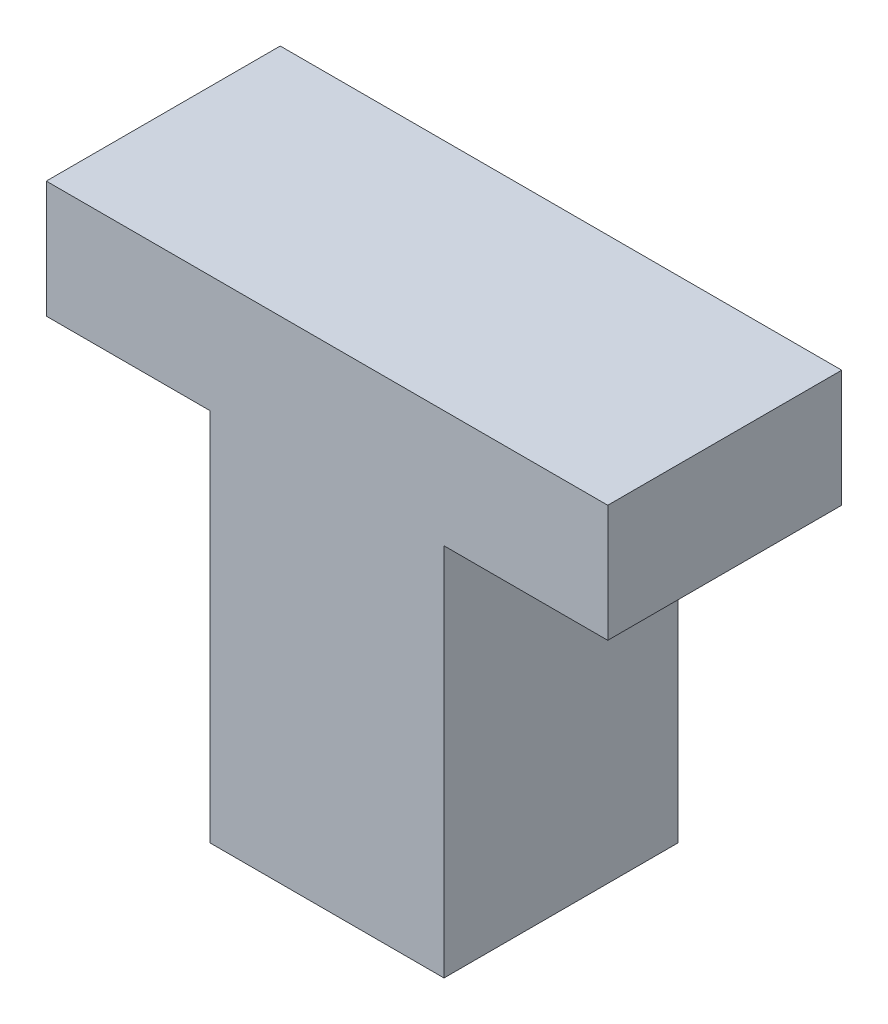
ISO-10303-21;
HEADER;
FILE_DESCRIPTION(('STEP AP214'),'2;1');
FILE_NAME('part.step','',(''),(''),'','','');
FILE_SCHEMA(('AUTOMOTIVE_DESIGN { 1 0 10303 214 1 1 1 1 }'));
ENDSEC;
DATA;
#1=APPLICATION_CONTEXT('core data for automotive mechanical design processes');
#2=APPLICATION_PROTOCOL_DEFINITION('international standard','automotive_design',2000,#1);
#3=PRODUCT_CONTEXT('',#1,'mechanical');
#4=PRODUCT('Part','Part','',(#3));
#5=PRODUCT_RELATED_PRODUCT_CATEGORY('part','',(#4));
#6=PRODUCT_DEFINITION_FORMATION('','',#4);
#7=PRODUCT_DEFINITION_CONTEXT('part definition',#1,'design');
#8=PRODUCT_DEFINITION('design','',#6,#7);
#9=PRODUCT_DEFINITION_SHAPE('','',#8);
#10=(LENGTH_UNIT() NAMED_UNIT(*) SI_UNIT(.MILLI.,.METRE.));
#11=(NAMED_UNIT(*) PLANE_ANGLE_UNIT() SI_UNIT($,.RADIAN.));
#12=(NAMED_UNIT(*) SI_UNIT($,.STERADIAN.) SOLID_ANGLE_UNIT());
#13=UNCERTAINTY_MEASURE_WITH_UNIT(LENGTH_MEASURE(1.E-05),#10,'distance_accuracy_value','');
#14=(GEOMETRIC_REPRESENTATION_CONTEXT(3) GLOBAL_UNCERTAINTY_ASSIGNED_CONTEXT((#13)) GLOBAL_UNIT_ASSIGNED_CONTEXT((#10,
#11,#12)) REPRESENTATION_CONTEXT('',''));
#15=CARTESIAN_POINT('',(0.,0.,0.));
#16=DIRECTION('',(0.,0.,1.));
#17=DIRECTION('',(1.,0.,0.));
#18=AXIS2_PLACEMENT_3D('',#15,#16,#17);
#19=CARTESIAN_POINT('',(5.,0.,5.));
#20=DIRECTION('',(0.,1.,0.));
#21=DIRECTION('',(-1.,0.,0.));
#22=AXIS2_PLACEMENT_3D('',#19,#20,#21);
#23=PLANE('',#22);
#24=DIRECTION('',(1.,0.,0.));
#25=VECTOR('',#24,1.);
#26=CARTESIAN_POINT('',(5.,0.,0.));
#27=LINE('',#26,#25);
#28=CARTESIAN_POINT('',(0.,0.,0.));
#29=VERTEX_POINT('',#28);
#30=CARTESIAN_POINT('',(5.,0.,0.));
#31=VERTEX_POINT('',#30);
#32=EDGE_CURVE('E129',#29,#31,#27,.T.);
#33=ORIENTED_EDGE('',*,*,#32,.T.);
#34=DIRECTION('',(0.,0.,-1.));
#35=VECTOR('',#34,1.);
#36=CARTESIAN_POINT('',(5.,0.,5.));
#37=LINE('',#36,#35);
#38=CARTESIAN_POINT('',(5.,0.,5.));
#39=VERTEX_POINT('',#38);
#40=EDGE_CURVE('E11',#39,#31,#37,.T.);
#41=ORIENTED_EDGE('',*,*,#40,.F.);
#42=DIRECTION('',(1.,0.,0.));
#43=VECTOR('',#42,1.);
#44=CARTESIAN_POINT('',(5.,0.,5.));
#45=LINE('',#44,#43);
#46=CARTESIAN_POINT('',(0.,0.,5.));
#47=VERTEX_POINT('',#46);
#48=EDGE_CURVE('E143',#47,#39,#45,.T.);
#49=ORIENTED_EDGE('',*,*,#48,.F.);
#50=DIRECTION('',(0.,0.,-1.));
#51=VECTOR('',#50,1.);
#52=CARTESIAN_POINT('',(0.,0.,5.));
#53=LINE('',#52,#51);
#54=EDGE_CURVE('E125',#47,#29,#53,.T.);
#55=ORIENTED_EDGE('',*,*,#54,.T.);
#56=EDGE_LOOP('',(#33,#41,#49,#55));
#57=FACE_BOUND('',#56,.T.);
#58=ADVANCED_FACE('F33',(#57),#23,.F.);
#59=CARTESIAN_POINT('',(5.,8.,5.));
#60=DIRECTION('',(-1.,0.,0.));
#61=DIRECTION('',(0.,-1.,0.));
#62=AXIS2_PLACEMENT_3D('',#59,#60,#61);
#63=PLANE('',#62);
#64=DIRECTION('',(0.,1.,0.));
#65=VECTOR('',#64,1.);
#66=CARTESIAN_POINT('',(5.,8.,0.));
#67=LINE('',#66,#65);
#68=CARTESIAN_POINT('',(5.,8.,0.));
#69=VERTEX_POINT('',#68);
#70=EDGE_CURVE('E132',#31,#69,#67,.T.);
#71=ORIENTED_EDGE('',*,*,#70,.T.);
#72=DIRECTION('',(0.,0.,-1.));
#73=VECTOR('',#72,1.);
#74=CARTESIAN_POINT('',(5.,8.,5.));
#75=LINE('',#74,#73);
#76=CARTESIAN_POINT('',(5.,8.,5.));
#77=VERTEX_POINT('',#76);
#78=EDGE_CURVE('E41',#77,#69,#75,.T.);
#79=ORIENTED_EDGE('',*,*,#78,.F.);
#80=DIRECTION('',(0.,1.,0.));
#81=VECTOR('',#80,1.);
#82=CARTESIAN_POINT('',(5.,8.,5.));
#83=LINE('',#82,#81);
#84=EDGE_CURVE('E92',#39,#77,#83,.T.);
#85=ORIENTED_EDGE('',*,*,#84,.F.);
#86=ORIENTED_EDGE('',*,*,#40,.T.);
#87=EDGE_LOOP('',(#71,#79,#85,#86));
#88=FACE_BOUND('',#87,.T.);
#89=ADVANCED_FACE('F178',(#88),#63,.F.);
#90=CARTESIAN_POINT('',(8.5,8.,5.));
#91=DIRECTION('',(0.,1.,0.));
#92=DIRECTION('',(0.,0.,1.));
#93=AXIS2_PLACEMENT_3D('',#90,#91,#92);
#94=PLANE('',#93);
#95=DIRECTION('',(1.,0.,0.));
#96=VECTOR('',#95,1.);
#97=CARTESIAN_POINT('',(8.5,8.,0.));
#98=LINE('',#97,#96);
#99=CARTESIAN_POINT('',(8.5,8.,0.));
#100=VERTEX_POINT('',#99);
#101=EDGE_CURVE('E134',#69,#100,#98,.T.);
#102=ORIENTED_EDGE('',*,*,#101,.T.);
#103=DIRECTION('',(0.,0.,-1.));
#104=VECTOR('',#103,1.);
#105=CARTESIAN_POINT('',(8.5,8.,5.));
#106=LINE('',#105,#104);
#107=CARTESIAN_POINT('',(8.5,8.,5.));
#108=VERTEX_POINT('',#107);
#109=EDGE_CURVE('E150',#108,#100,#106,.T.);
#110=ORIENTED_EDGE('',*,*,#109,.F.);
#111=DIRECTION('',(1.,0.,0.));
#112=VECTOR('',#111,1.);
#113=CARTESIAN_POINT('',(8.5,8.,5.));
#114=LINE('',#113,#112);
#115=EDGE_CURVE('E158',#77,#108,#114,.T.);
#116=ORIENTED_EDGE('',*,*,#115,.F.);
#117=ORIENTED_EDGE('',*,*,#78,.T.);
#118=EDGE_LOOP('',(#102,#110,#116,#117));
#119=FACE_BOUND('',#118,.T.);
#120=ADVANCED_FACE('F156',(#119),#94,.F.);
#121=CARTESIAN_POINT('',(8.5,10.5,5.));
#122=DIRECTION('',(-1.,0.,0.));
#123=DIRECTION('',(0.,0.,1.));
#124=AXIS2_PLACEMENT_3D('',#121,#122,#123);
#125=PLANE('',#124);
#126=DIRECTION('',(0.,1.,0.));
#127=VECTOR('',#126,1.);
#128=CARTESIAN_POINT('',(8.5,10.5,0.));
#129=LINE('',#128,#127);
#130=CARTESIAN_POINT('',(8.5,10.5,0.));
#131=VERTEX_POINT('',#130);
#132=EDGE_CURVE('E136',#100,#131,#129,.T.);
#133=ORIENTED_EDGE('',*,*,#132,.T.);
#134=DIRECTION('',(0.,0.,-1.));
#135=VECTOR('',#134,1.);
#136=CARTESIAN_POINT('',(8.5,10.5,5.));
#137=LINE('',#136,#135);
#138=CARTESIAN_POINT('',(8.5,10.5,5.));
#139=VERTEX_POINT('',#138);
#140=EDGE_CURVE('E147',#139,#131,#137,.T.);
#141=ORIENTED_EDGE('',*,*,#140,.F.);
#142=DIRECTION('',(0.,1.,0.));
#143=VECTOR('',#142,1.);
#144=CARTESIAN_POINT('',(8.5,10.5,5.));
#145=LINE('',#144,#143);
#146=EDGE_CURVE('E170',#108,#139,#145,.T.);
#147=ORIENTED_EDGE('',*,*,#146,.F.);
#148=ORIENTED_EDGE('',*,*,#109,.T.);
#149=EDGE_LOOP('',(#133,#141,#147,#148));
#150=FACE_BOUND('',#149,.T.);
#151=ADVANCED_FACE('F166',(#150),#125,.F.);
#152=CARTESIAN_POINT('',(-3.5,10.5,5.));
#153=DIRECTION('',(0.,-1.,0.));
#154=DIRECTION('',(0.,0.,-1.));
#155=AXIS2_PLACEMENT_3D('',#152,#153,#154);
#156=PLANE('',#155);
#157=DIRECTION('',(-1.,0.,0.));
#158=VECTOR('',#157,1.);
#159=CARTESIAN_POINT('',(-3.5,10.5,0.));
#160=LINE('',#159,#158);
#161=CARTESIAN_POINT('',(-3.5,10.5,0.));
#162=VERTEX_POINT('',#161);
#163=EDGE_CURVE('E138',#131,#162,#160,.T.);
#164=ORIENTED_EDGE('',*,*,#163,.T.);
#165=DIRECTION('',(0.,0.,-1.));
#166=VECTOR('',#165,1.);
#167=CARTESIAN_POINT('',(-3.5,10.5,5.));
#168=LINE('',#167,#166);
#169=CARTESIAN_POINT('',(-3.5,10.5,5.));
#170=VERTEX_POINT('',#169);
#171=EDGE_CURVE('E120',#170,#162,#168,.T.);
#172=ORIENTED_EDGE('',*,*,#171,.F.);
#173=DIRECTION('',(-1.,0.,0.));
#174=VECTOR('',#173,1.);
#175=CARTESIAN_POINT('',(-3.5,10.5,5.));
#176=LINE('',#175,#174);
#177=EDGE_CURVE('E111',#139,#170,#176,.T.);
#178=ORIENTED_EDGE('',*,*,#177,.F.);
#179=ORIENTED_EDGE('',*,*,#140,.T.);
#180=EDGE_LOOP('',(#164,#172,#178,#179));
#181=FACE_BOUND('',#180,.T.);
#182=ADVANCED_FACE('F169',(#181),#156,.F.);
#183=CARTESIAN_POINT('',(-3.5,8.,5.));
#184=DIRECTION('',(1.,0.,0.));
#185=DIRECTION('',(0.,1.,0.));
#186=AXIS2_PLACEMENT_3D('',#183,#184,#185);
#187=PLANE('',#186);
#188=DIRECTION('',(0.,-1.,0.));
#189=VECTOR('',#188,1.);
#190=CARTESIAN_POINT('',(-3.5,8.,0.));
#191=LINE('',#190,#189);
#192=CARTESIAN_POINT('',(-3.5,8.,0.));
#193=VERTEX_POINT('',#192);
#194=EDGE_CURVE('E119',#162,#193,#191,.T.);
#195=ORIENTED_EDGE('',*,*,#194,.T.);
#196=DIRECTION('',(0.,0.,-1.));
#197=VECTOR('',#196,1.);
#198=CARTESIAN_POINT('',(-3.5,8.,5.));
#199=LINE('',#198,#197);
#200=CARTESIAN_POINT('',(-3.5,8.,5.));
#201=VERTEX_POINT('',#200);
#202=EDGE_CURVE('E116',#201,#193,#199,.T.);
#203=ORIENTED_EDGE('',*,*,#202,.F.);
#204=DIRECTION('',(0.,-1.,0.));
#205=VECTOR('',#204,1.);
#206=CARTESIAN_POINT('',(-3.5,8.,5.));
#207=LINE('',#206,#205);
#208=EDGE_CURVE('E105',#170,#201,#207,.T.);
#209=ORIENTED_EDGE('',*,*,#208,.F.);
#210=ORIENTED_EDGE('',*,*,#171,.T.);
#211=EDGE_LOOP('',(#195,#203,#209,#210));
#212=FACE_BOUND('',#211,.T.);
#213=ADVANCED_FACE('F117',(#212),#187,.F.);
#214=CARTESIAN_POINT('',(0.,8.,5.));
#215=DIRECTION('',(0.,1.,0.));
#216=DIRECTION('',(0.,0.,1.));
#217=AXIS2_PLACEMENT_3D('',#214,#215,#216);
#218=PLANE('',#217);
#219=DIRECTION('',(1.,0.,0.));
#220=VECTOR('',#219,1.);
#221=CARTESIAN_POINT('',(0.,8.,0.));
#222=LINE('',#221,#220);
#223=CARTESIAN_POINT('',(0.,8.,0.));
#224=VERTEX_POINT('',#223);
#225=EDGE_CURVE('E78',#193,#224,#222,.T.);
#226=ORIENTED_EDGE('',*,*,#225,.T.);
#227=DIRECTION('',(0.,0.,-1.));
#228=VECTOR('',#227,1.);
#229=CARTESIAN_POINT('',(0.,8.,5.));
#230=LINE('',#229,#228);
#231=CARTESIAN_POINT('',(0.,8.,5.));
#232=VERTEX_POINT('',#231);
#233=EDGE_CURVE('E121',#232,#224,#230,.T.);
#234=ORIENTED_EDGE('',*,*,#233,.F.);
#235=DIRECTION('',(1.,0.,0.));
#236=VECTOR('',#235,1.);
#237=CARTESIAN_POINT('',(0.,8.,5.));
#238=LINE('',#237,#236);
#239=EDGE_CURVE('E109',#201,#232,#238,.T.);
#240=ORIENTED_EDGE('',*,*,#239,.F.);
#241=ORIENTED_EDGE('',*,*,#202,.T.);
#242=EDGE_LOOP('',(#226,#234,#240,#241));
#243=FACE_BOUND('',#242,.T.);
#244=ADVANCED_FACE('F123',(#243),#218,.F.);
#245=CARTESIAN_POINT('',(0.,0.,5.));
#246=DIRECTION('',(1.,0.,0.));
#247=DIRECTION('',(0.,1.,0.));
#248=AXIS2_PLACEMENT_3D('',#245,#246,#247);
#249=PLANE('',#248);
#250=DIRECTION('',(0.,-1.,0.));
#251=VECTOR('',#250,1.);
#252=CARTESIAN_POINT('',(0.,0.,0.));
#253=LINE('',#252,#251);
#254=EDGE_CURVE('E84',#224,#29,#253,.T.);
#255=ORIENTED_EDGE('',*,*,#254,.T.);
#256=ORIENTED_EDGE('',*,*,#54,.F.);
#257=DIRECTION('',(0.,-1.,0.));
#258=VECTOR('',#257,1.);
#259=CARTESIAN_POINT('',(0.,0.,5.));
#260=LINE('',#259,#258);
#261=EDGE_CURVE('E49',#232,#47,#260,.T.);
#262=ORIENTED_EDGE('',*,*,#261,.F.);
#263=ORIENTED_EDGE('',*,*,#233,.T.);
#264=EDGE_LOOP('',(#255,#256,#262,#263));
#265=FACE_BOUND('',#264,.T.);
#266=ADVANCED_FACE('F194',(#265),#249,.F.);
#267=CARTESIAN_POINT('',(0.,0.,5.));
#268=DIRECTION('',(0.,0.,-1.));
#269=DIRECTION('',(-1.,0.,0.));
#270=AXIS2_PLACEMENT_3D('',#267,#268,#269);
#271=PLANE('',#270);
#272=ORIENTED_EDGE('',*,*,#48,.T.);
#273=ORIENTED_EDGE('',*,*,#84,.T.);
#274=ORIENTED_EDGE('',*,*,#115,.T.);
#275=ORIENTED_EDGE('',*,*,#146,.T.);
#276=ORIENTED_EDGE('',*,*,#177,.T.);
#277=ORIENTED_EDGE('',*,*,#208,.T.);
#278=ORIENTED_EDGE('',*,*,#239,.T.);
#279=ORIENTED_EDGE('',*,*,#261,.T.);
#280=EDGE_LOOP('',(#272,#273,#274,#275,#276,#277,#278,#279));
#281=FACE_BOUND('',#280,.T.);
#282=ADVANCED_FACE('F107',(#281),#271,.F.);
#283=CARTESIAN_POINT('',(0.,0.,0.));
#284=DIRECTION('',(0.,0.,-1.));
#285=DIRECTION('',(-1.,0.,0.));
#286=AXIS2_PLACEMENT_3D('',#283,#284,#285);
#287=PLANE('',#286);
#288=ORIENTED_EDGE('',*,*,#32,.F.);
#289=ORIENTED_EDGE('',*,*,#254,.F.);
#290=ORIENTED_EDGE('',*,*,#225,.F.);
#291=ORIENTED_EDGE('',*,*,#194,.F.);
#292=ORIENTED_EDGE('',*,*,#163,.F.);
#293=ORIENTED_EDGE('',*,*,#132,.F.);
#294=ORIENTED_EDGE('',*,*,#101,.F.);
#295=ORIENTED_EDGE('',*,*,#70,.F.);
#296=EDGE_LOOP('',(#288,#289,#290,#291,#292,#293,#294,#295));
#297=FACE_BOUND('',#296,.T.);
#298=ADVANCED_FACE('F162',(#297),#287,.T.);
#299=CLOSED_SHELL('',(#58,#89,#120,#151,#182,#213,#244,#266,#282,#298));
#300=MANIFOLD_SOLID_BREP('B2',#299);
#301=ADVANCED_BREP_SHAPE_REPRESENTATION('',(#18,#300),#14);
#302=SHAPE_DEFINITION_REPRESENTATION(#9,#301);
ENDSEC;
END-ISO-10303-21;
